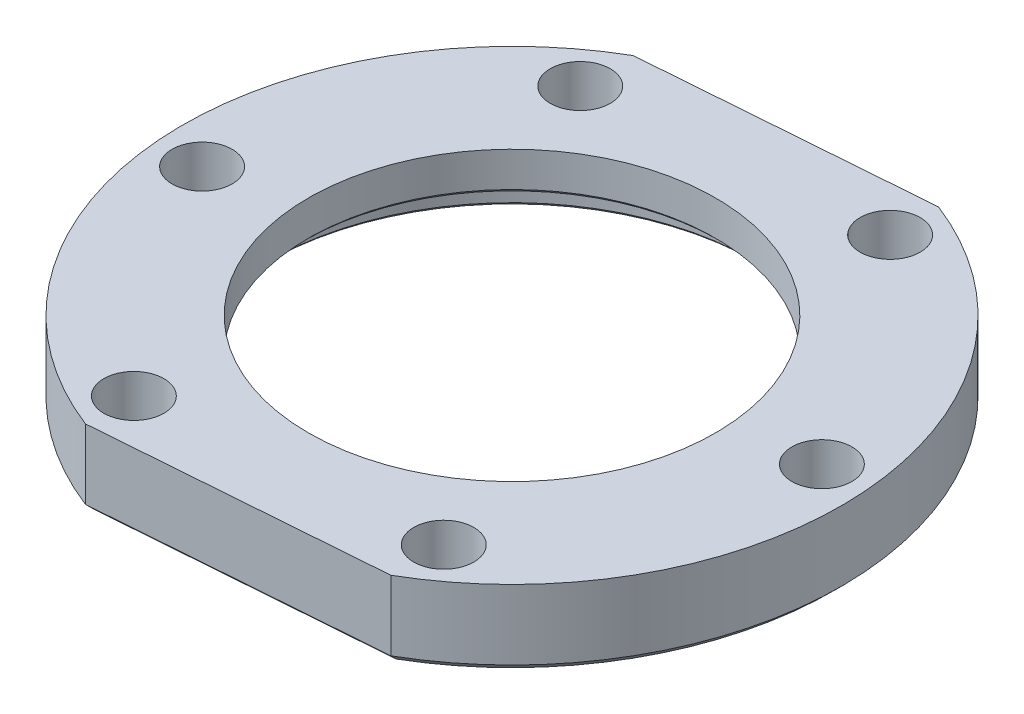
ISO-10303-21;
HEADER;
FILE_DESCRIPTION(('STEP AP214'),'2;1');
FILE_NAME('part.step','',(''),(''),'','','');
FILE_SCHEMA(('AUTOMOTIVE_DESIGN { 1 0 10303 214 1 1 1 1 }'));
ENDSEC;
DATA;
#1=APPLICATION_CONTEXT('core data for automotive mechanical design processes');
#2=APPLICATION_PROTOCOL_DEFINITION('international standard','automotive_design',2000,#1);
#3=PRODUCT_CONTEXT('',#1,'mechanical');
#4=PRODUCT('Part','Part','',(#3));
#5=PRODUCT_RELATED_PRODUCT_CATEGORY('part','',(#4));
#6=PRODUCT_DEFINITION_FORMATION('','',#4);
#7=PRODUCT_DEFINITION_CONTEXT('part definition',#1,'design');
#8=PRODUCT_DEFINITION('design','',#6,#7);
#9=PRODUCT_DEFINITION_SHAPE('','',#8);
#10=(LENGTH_UNIT() NAMED_UNIT(*) SI_UNIT(.MILLI.,.METRE.));
#11=(NAMED_UNIT(*) PLANE_ANGLE_UNIT() SI_UNIT($,.RADIAN.));
#12=(NAMED_UNIT(*) SI_UNIT($,.STERADIAN.) SOLID_ANGLE_UNIT());
#13=UNCERTAINTY_MEASURE_WITH_UNIT(LENGTH_MEASURE(1.E-05),#10,'distance_accuracy_value','');
#14=(GEOMETRIC_REPRESENTATION_CONTEXT(3) GLOBAL_UNCERTAINTY_ASSIGNED_CONTEXT((#13)) GLOBAL_UNIT_ASSIGNED_CONTEXT((#10,
#11,#12)) REPRESENTATION_CONTEXT('',''));
#15=CARTESIAN_POINT('',(0.,0.,0.));
#16=DIRECTION('',(0.,0.,1.));
#17=DIRECTION('',(1.,0.,0.));
#18=AXIS2_PLACEMENT_3D('',#15,#16,#17);
#19=CARTESIAN_POINT('',(0.,4.,0.));
#20=DIRECTION('',(0.,-1.,0.));
#21=DIRECTION('',(0.,0.,-1.));
#22=AXIS2_PLACEMENT_3D('',#19,#20,#21);
#23=CYLINDRICAL_SURFACE('',#22,12.5);
#24=CARTESIAN_POINT('',(0.,0.199999999999994,0.));
#25=DIRECTION('',(0.,1.,0.));
#26=DIRECTION('',(0.,0.,1.));
#27=AXIS2_PLACEMENT_3D('',#24,#25,#26);
#28=CIRCLE('',#27,12.5);
#29=CARTESIAN_POINT('',(0.,0.199999999999994,-12.5));
#30=VERTEX_POINT('',#29);
#31=EDGE_CURVE('E140',#30,#30,#28,.F.);
#32=ORIENTED_EDGE('',*,*,#31,.T.);
#33=EDGE_LOOP('',(#32));
#34=FACE_BOUND('',#33,.T.);
#35=CARTESIAN_POINT('',(0.,1.8,0.));
#36=DIRECTION('',(0.,1.,0.));
#37=DIRECTION('',(0.,0.,1.));
#38=AXIS2_PLACEMENT_3D('',#35,#36,#37);
#39=CIRCLE('',#38,12.5);
#40=CARTESIAN_POINT('',(0.,1.8,12.5));
#41=VERTEX_POINT('',#40);
#42=EDGE_CURVE('E137',#41,#41,#39,.T.);
#43=ORIENTED_EDGE('',*,*,#42,.T.);
#44=EDGE_LOOP('',(#43));
#45=FACE_BOUND('',#44,.T.);
#46=ADVANCED_FACE('F35',(#34,#45),#23,.F.);
#47=CARTESIAN_POINT('',(0.,4.,0.));
#48=DIRECTION('',(0.,-1.,0.));
#49=DIRECTION('',(0.,0.,-1.));
#50=AXIS2_PLACEMENT_3D('',#47,#48,#49);
#51=CYLINDRICAL_SURFACE('',#50,17.);
#52=DIRECTION('',(0.,1.,0.));
#53=VECTOR('',#52,1.);
#54=CARTESIAN_POINT('',(-8.485,0.,-14.7310819358254));
#55=LINE('',#54,#53);
#56=CARTESIAN_POINT('',(-8.485,0.400000000000005,-14.7310819358254));
#57=VERTEX_POINT('',#56);
#58=CARTESIAN_POINT('',(-8.485,4.,-14.7310819358254));
#59=VERTEX_POINT('',#58);
#60=EDGE_CURVE('E301',#57,#59,#55,.T.);
#61=ORIENTED_EDGE('',*,*,#60,.F.);
#62=CARTESIAN_POINT('',(0.,0.400000000000005,0.));
#63=DIRECTION('',(0.,1.,0.));
#64=DIRECTION('',(0.,0.,1.));
#65=AXIS2_PLACEMENT_3D('',#62,#63,#64);
#66=CIRCLE('',#65,17.);
#67=CARTESIAN_POINT('',(-6.15443615108892,0.400000000000005,15.846858226859));
#68=VERTEX_POINT('',#67);
#69=EDGE_CURVE('E153',#57,#68,#66,.T.);
#70=ORIENTED_EDGE('',*,*,#69,.T.);
#71=DIRECTION('',(0.,1.,0.));
#72=VECTOR('',#71,1.);
#73=CARTESIAN_POINT('',(-6.15443615108892,0.,15.846858226859));
#74=LINE('',#73,#72);
#75=CARTESIAN_POINT('',(-6.15443615108892,4.,15.846858226859));
#76=VERTEX_POINT('',#75);
#77=EDGE_CURVE('E104',#68,#76,#74,.T.);
#78=ORIENTED_EDGE('',*,*,#77,.T.);
#79=CARTESIAN_POINT('',(0.,4.,0.));
#80=DIRECTION('',(0.,1.,0.));
#81=DIRECTION('',(0.,0.,1.));
#82=AXIS2_PLACEMENT_3D('',#79,#80,#81);
#83=CIRCLE('',#82,17.);
#84=EDGE_CURVE('E113',#59,#76,#83,.T.);
#85=ORIENTED_EDGE('',*,*,#84,.F.);
#86=EDGE_LOOP('',(#61,#70,#78,#85));
#87=FACE_BOUND('',#86,.T.);
#88=ADVANCED_FACE('F198',(#87),#51,.T.);
#89=CARTESIAN_POINT('',(0.,4.,0.));
#90=DIRECTION('',(0.,1.,0.));
#91=DIRECTION('',(0.,0.,1.));
#92=AXIS2_PLACEMENT_3D('',#89,#90,#91);
#93=PLANE('',#92);
#94=CARTESIAN_POINT('',(6.15443615108892,4.,-13.3508994366904));
#95=DIRECTION('',(0.,1.,0.));
#96=DIRECTION('',(0.,0.,1.));
#97=AXIS2_PLACEMENT_3D('',#94,#95,#96);
#98=CIRCLE('',#97,1.55);
#99=CARTESIAN_POINT('',(6.15443615108892,4.,-11.8008994366904));
#100=VERTEX_POINT('',#99);
#101=EDGE_CURVE('E310',#100,#100,#98,.T.);
#102=ORIENTED_EDGE('',*,*,#101,.F.);
#103=EDGE_LOOP('',(#102));
#104=FACE_BOUND('',#103,.T.);
#105=DIRECTION('',(0.997108065509057,0.,-0.0759967479355897));
#106=VECTOR('',#105,1.);
#107=CARTESIAN_POINT('',(-8.485,4.,-14.7310819358254));
#108=LINE('',#107,#106);
#109=CARTESIAN_POINT('',(6.15443615108892,4.,-15.846858226859));
#110=VERTEX_POINT('',#109);
#111=EDGE_CURVE('E303',#59,#110,#108,.T.);
#112=ORIENTED_EDGE('',*,*,#111,.F.);
#113=ORIENTED_EDGE('',*,*,#84,.T.);
#114=DIRECTION('',(-0.997108065509057,0.,0.0759967479355892));
#115=VECTOR('',#114,1.);
#116=CARTESIAN_POINT('',(-6.15443615108892,4.,15.846858226859));
#117=LINE('',#116,#115);
#118=CARTESIAN_POINT('',(8.48499999999999,4.,14.7310819358254));
#119=VERTEX_POINT('',#118);
#120=EDGE_CURVE('E98',#119,#76,#117,.T.);
#121=ORIENTED_EDGE('',*,*,#120,.F.);
#122=EDGE_CURVE('E111',#119,#110,#83,.T.);
#123=ORIENTED_EDGE('',*,*,#122,.T.);
#124=EDGE_LOOP('',(#112,#113,#121,#123));
#125=FACE_BOUND('',#124,.T.);
#126=CARTESIAN_POINT('',(14.6394361510896,4.,-1.34555166553371));
#127=DIRECTION('',(0.,1.,0.));
#128=DIRECTION('',(0.,0.,1.));
#129=AXIS2_PLACEMENT_3D('',#126,#127,#128);
#130=CIRCLE('',#129,1.55);
#131=CARTESIAN_POINT('',(14.6394361510896,4.,0.204448334466295));
#132=VERTEX_POINT('',#131);
#133=EDGE_CURVE('E289',#132,#132,#130,.T.);
#134=ORIENTED_EDGE('',*,*,#133,.F.);
#135=EDGE_LOOP('',(#134));
#136=FACE_BOUND('',#135,.T.);
#137=CARTESIAN_POINT('',(8.48500000000136,4.,12.0053477711562));
#138=DIRECTION('',(0.,1.,0.));
#139=DIRECTION('',(0.,0.,1.));
#140=AXIS2_PLACEMENT_3D('',#137,#138,#139);
#141=CIRCLE('',#140,1.55);
#142=CARTESIAN_POINT('',(8.48500000000136,4.,13.5553477711562));
#143=VERTEX_POINT('',#142);
#144=EDGE_CURVE('E285',#143,#143,#141,.T.);
#145=ORIENTED_EDGE('',*,*,#144,.F.);
#146=EDGE_LOOP('',(#145));
#147=FACE_BOUND('',#146,.T.);
#148=CARTESIAN_POINT('',(-14.6394361510882,4.,1.34555166553271));
#149=DIRECTION('',(0.,1.,0.));
#150=DIRECTION('',(0.,0.,1.));
#151=AXIS2_PLACEMENT_3D('',#148,#149,#150);
#152=CIRCLE('',#151,1.55);
#153=CARTESIAN_POINT('',(-14.6394361510882,4.,2.89555166553271));
#154=VERTEX_POINT('',#153);
#155=EDGE_CURVE('E103',#154,#154,#152,.T.);
#156=ORIENTED_EDGE('',*,*,#155,.F.);
#157=EDGE_LOOP('',(#156));
#158=FACE_BOUND('',#157,.T.);
#159=CARTESIAN_POINT('',(-6.15443615108756,4.,13.3508994366894));
#160=DIRECTION('',(0.,1.,0.));
#161=DIRECTION('',(0.,0.,1.));
#162=AXIS2_PLACEMENT_3D('',#159,#160,#161);
#163=CIRCLE('',#162,1.55);
#164=CARTESIAN_POINT('',(-6.15443615108756,4.,14.9008994366894));
#165=VERTEX_POINT('',#164);
#166=EDGE_CURVE('E292',#165,#165,#163,.T.);
#167=ORIENTED_EDGE('',*,*,#166,.F.);
#168=EDGE_LOOP('',(#167));
#169=FACE_BOUND('',#168,.T.);
#170=CARTESIAN_POINT('',(-8.485,4.,-12.0053477711572));
#171=DIRECTION('',(0.,1.,0.));
#172=DIRECTION('',(0.,0.,1.));
#173=AXIS2_PLACEMENT_3D('',#170,#171,#172);
#174=CIRCLE('',#173,1.55);
#175=CARTESIAN_POINT('',(-8.485,4.,-10.4553477711572));
#176=VERTEX_POINT('',#175);
#177=EDGE_CURVE('E126',#176,#176,#174,.T.);
#178=ORIENTED_EDGE('',*,*,#177,.F.);
#179=EDGE_LOOP('',(#178));
#180=FACE_BOUND('',#179,.T.);
#181=CARTESIAN_POINT('',(0.,4.,0.));
#182=DIRECTION('',(0.,1.,0.));
#183=DIRECTION('',(0.,0.,1.));
#184=AXIS2_PLACEMENT_3D('',#181,#182,#183);
#185=CIRCLE('',#184,10.5);
#186=CARTESIAN_POINT('',(0.,4.,10.5));
#187=VERTEX_POINT('',#186);
#188=EDGE_CURVE('E114',#187,#187,#185,.T.);
#189=ORIENTED_EDGE('',*,*,#188,.F.);
#190=EDGE_LOOP('',(#189));
#191=FACE_BOUND('',#190,.T.);
#192=ADVANCED_FACE('F109',(#104,#125,#136,#147,#158,#169,#180,#191),#93,.T.);
#193=CARTESIAN_POINT('',(0.,0.,0.));
#194=DIRECTION('',(0.,1.,0.));
#195=DIRECTION('',(0.,0.,1.));
#196=AXIS2_PLACEMENT_3D('',#193,#194,#195);
#197=PLANE('',#196);
#198=CARTESIAN_POINT('',(0.,0.,0.));
#199=DIRECTION('',(0.,1.,0.));
#200=DIRECTION('',(0.,0.,1.));
#201=AXIS2_PLACEMENT_3D('',#198,#199,#200);
#202=CIRCLE('',#201,16.6);
#203=CARTESIAN_POINT('',(6.09371441797392,0.,-15.441070059817));
#204=VERTEX_POINT('',#203);
#205=CARTESIAN_POINT('',(8.36348086853652,0.,14.3391836504602));
#206=VERTEX_POINT('',#205);
#207=EDGE_CURVE('E145',#204,#206,#202,.F.);
#208=ORIENTED_EDGE('',*,*,#207,.T.);
#209=DIRECTION('',(-0.997108065509057,0.,0.0759967479355892));
#210=VECTOR('',#209,1.);
#211=CARTESIAN_POINT('',(1.1348832252813,0.,14.8901268551386));
#212=LINE('',#211,#210);
#213=CARTESIAN_POINT('',(-6.09371441797393,0.,15.441070059817));
#214=VERTEX_POINT('',#213);
#215=EDGE_CURVE('E149',#206,#214,#212,.T.);
#216=ORIENTED_EDGE('',*,*,#215,.T.);
#217=CARTESIAN_POINT('',(0.,0.,0.));
#218=DIRECTION('',(0.,1.,0.));
#219=DIRECTION('',(0.,0.,1.));
#220=AXIS2_PLACEMENT_3D('',#217,#218,#219);
#221=CIRCLE('',#220,16.6);
#222=CARTESIAN_POINT('',(-8.36348086853654,0.,-14.3391836504601));
#223=VERTEX_POINT('',#222);
#224=EDGE_CURVE('E147',#214,#223,#221,.F.);
#225=ORIENTED_EDGE('',*,*,#224,.T.);
#226=DIRECTION('',(0.997108065509057,0.,-0.0759967479355897));
#227=VECTOR('',#226,1.);
#228=CARTESIAN_POINT('',(-1.1348832252813,0.,-14.8901268551386));
#229=LINE('',#228,#227);
#230=EDGE_CURVE('E143',#223,#204,#229,.T.);
#231=ORIENTED_EDGE('',*,*,#230,.T.);
#232=EDGE_LOOP('',(#208,#216,#225,#231));
#233=FACE_BOUND('',#232,.T.);
#234=CARTESIAN_POINT('',(0.,0.,0.));
#235=DIRECTION('',(0.,1.,0.));
#236=DIRECTION('',(0.,0.,1.));
#237=AXIS2_PLACEMENT_3D('',#234,#235,#236);
#238=CIRCLE('',#237,12.7);
#239=CARTESIAN_POINT('',(0.,0.,-12.7));
#240=VERTEX_POINT('',#239);
#241=EDGE_CURVE('E134',#240,#240,#238,.T.);
#242=ORIENTED_EDGE('',*,*,#241,.T.);
#243=EDGE_LOOP('',(#242));
#244=FACE_BOUND('',#243,.T.);
#245=CARTESIAN_POINT('',(6.15443615108892,0.,-13.3508994366904));
#246=DIRECTION('',(0.,1.,0.));
#247=DIRECTION('',(0.,0.,1.));
#248=AXIS2_PLACEMENT_3D('',#245,#246,#247);
#249=CIRCLE('',#248,1.55);
#250=CARTESIAN_POINT('',(6.15443615108892,0.,-11.8008994366904));
#251=VERTEX_POINT('',#250);
#252=EDGE_CURVE('E334',#251,#251,#249,.T.);
#253=ORIENTED_EDGE('',*,*,#252,.T.);
#254=EDGE_LOOP('',(#253));
#255=FACE_BOUND('',#254,.T.);
#256=CARTESIAN_POINT('',(14.6394361510896,0.,-1.34555166553371));
#257=DIRECTION('',(0.,1.,0.));
#258=DIRECTION('',(0.,0.,1.));
#259=AXIS2_PLACEMENT_3D('',#256,#257,#258);
#260=CIRCLE('',#259,1.55);
#261=CARTESIAN_POINT('',(14.6394361510896,0.,0.204448334466295));
#262=VERTEX_POINT('',#261);
#263=EDGE_CURVE('E308',#262,#262,#260,.T.);
#264=ORIENTED_EDGE('',*,*,#263,.T.);
#265=EDGE_LOOP('',(#264));
#266=FACE_BOUND('',#265,.T.);
#267=CARTESIAN_POINT('',(8.48500000000136,0.,12.0053477711562));
#268=DIRECTION('',(0.,1.,0.));
#269=DIRECTION('',(0.,0.,1.));
#270=AXIS2_PLACEMENT_3D('',#267,#268,#269);
#271=CIRCLE('',#270,1.55);
#272=CARTESIAN_POINT('',(8.48500000000136,0.,13.5553477711562));
#273=VERTEX_POINT('',#272);
#274=EDGE_CURVE('E282',#273,#273,#271,.T.);
#275=ORIENTED_EDGE('',*,*,#274,.T.);
#276=EDGE_LOOP('',(#275));
#277=FACE_BOUND('',#276,.T.);
#278=CARTESIAN_POINT('',(-14.6394361510882,0.,1.34555166553271));
#279=DIRECTION('',(0.,1.,0.));
#280=DIRECTION('',(0.,0.,1.));
#281=AXIS2_PLACEMENT_3D('',#278,#279,#280);
#282=CIRCLE('',#281,1.55);
#283=CARTESIAN_POINT('',(-14.6394361510882,0.,2.89555166553271));
#284=VERTEX_POINT('',#283);
#285=EDGE_CURVE('E330',#284,#284,#282,.T.);
#286=ORIENTED_EDGE('',*,*,#285,.T.);
#287=EDGE_LOOP('',(#286));
#288=FACE_BOUND('',#287,.T.);
#289=CARTESIAN_POINT('',(-6.15443615108756,0.,13.3508994366894));
#290=DIRECTION('',(0.,1.,0.));
#291=DIRECTION('',(0.,0.,1.));
#292=AXIS2_PLACEMENT_3D('',#289,#290,#291);
#293=CIRCLE('',#292,1.55);
#294=CARTESIAN_POINT('',(-6.15443615108756,0.,14.9008994366894));
#295=VERTEX_POINT('',#294);
#296=EDGE_CURVE('E287',#295,#295,#293,.T.);
#297=ORIENTED_EDGE('',*,*,#296,.T.);
#298=EDGE_LOOP('',(#297));
#299=FACE_BOUND('',#298,.T.);
#300=CARTESIAN_POINT('',(-8.485,0.,-12.0053477711572));
#301=DIRECTION('',(0.,1.,0.));
#302=DIRECTION('',(0.,0.,1.));
#303=AXIS2_PLACEMENT_3D('',#300,#301,#302);
#304=CIRCLE('',#303,1.55);
#305=CARTESIAN_POINT('',(-8.485,0.,-10.4553477711572));
#306=VERTEX_POINT('',#305);
#307=EDGE_CURVE('E124',#306,#306,#304,.T.);
#308=ORIENTED_EDGE('',*,*,#307,.T.);
#309=EDGE_LOOP('',(#308));
#310=FACE_BOUND('',#309,.T.);
#311=ADVANCED_FACE('F213',(#233,#244,#255,#266,#277,#288,#299,#310),#197,.F.);
#312=DIRECTION('',(0.,1.,0.));
#313=VECTOR('',#312,1.);
#314=CARTESIAN_POINT('',(8.48499999999999,0.,14.7310819358254));
#315=LINE('',#314,#313);
#316=CARTESIAN_POINT('',(8.48499999999999,0.400000000000005,14.7310819358254));
#317=VERTEX_POINT('',#316);
#318=EDGE_CURVE('E94',#317,#119,#315,.T.);
#319=ORIENTED_EDGE('',*,*,#318,.F.);
#320=CARTESIAN_POINT('',(0.,0.400000000000005,0.));
#321=DIRECTION('',(0.,1.,0.));
#322=DIRECTION('',(0.,0.,1.));
#323=AXIS2_PLACEMENT_3D('',#320,#321,#322);
#324=CIRCLE('',#323,17.);
#325=CARTESIAN_POINT('',(6.15443615108892,0.400000000000005,-15.846858226859));
#326=VERTEX_POINT('',#325);
#327=EDGE_CURVE('E50',#317,#326,#324,.T.);
#328=ORIENTED_EDGE('',*,*,#327,.T.);
#329=DIRECTION('',(0.,1.,0.));
#330=VECTOR('',#329,1.);
#331=CARTESIAN_POINT('',(6.15443615108892,0.,-15.846858226859));
#332=LINE('',#331,#330);
#333=EDGE_CURVE('E117',#326,#110,#332,.T.);
#334=ORIENTED_EDGE('',*,*,#333,.T.);
#335=ORIENTED_EDGE('',*,*,#122,.F.);
#336=EDGE_LOOP('',(#319,#328,#334,#335));
#337=FACE_BOUND('',#336,.T.);
#338=ADVANCED_FACE('F116',(#337),#51,.T.);
#339=CARTESIAN_POINT('',(-6.15443615108892,0.,15.846858226859));
#340=DIRECTION('',(-0.0759967479355892,0.,-0.997108065509057));
#341=DIRECTION('',(-0.997108065509057,0.,0.0759967479355892));
#342=AXIS2_PLACEMENT_3D('',#339,#340,#341);
#343=PLANE('',#342);
#344=ORIENTED_EDGE('',*,*,#77,.F.);
#345=DIRECTION('',(0.997108065509057,0.,-0.0759967479355892));
#346=VECTOR('',#345,1.);
#347=CARTESIAN_POINT('',(-6.15443615108892,0.400000000000004,15.846858226859));
#348=LINE('',#347,#346);
#349=EDGE_CURVE('E101',#68,#317,#348,.T.);
#350=ORIENTED_EDGE('',*,*,#349,.T.);
#351=ORIENTED_EDGE('',*,*,#318,.T.);
#352=ORIENTED_EDGE('',*,*,#120,.T.);
#353=EDGE_LOOP('',(#344,#350,#351,#352));
#354=FACE_BOUND('',#353,.T.);
#355=ADVANCED_FACE('F97',(#354),#343,.F.);
#356=CARTESIAN_POINT('',(-8.485,0.,-14.7310819358254));
#357=DIRECTION('',(0.0759967479355897,0.,0.997108065509057));
#358=DIRECTION('',(0.997108065509057,0.,-0.0759967479355897));
#359=AXIS2_PLACEMENT_3D('',#356,#357,#358);
#360=PLANE('',#359);
#361=ORIENTED_EDGE('',*,*,#333,.F.);
#362=DIRECTION('',(-0.997108065509057,0.,0.0759967479355897));
#363=VECTOR('',#362,1.);
#364=CARTESIAN_POINT('',(-8.485,0.400000000000005,-14.7310819358254));
#365=LINE('',#364,#363);
#366=EDGE_CURVE('E11',#326,#57,#365,.T.);
#367=ORIENTED_EDGE('',*,*,#366,.T.);
#368=ORIENTED_EDGE('',*,*,#60,.T.);
#369=ORIENTED_EDGE('',*,*,#111,.T.);
#370=EDGE_LOOP('',(#361,#367,#368,#369));
#371=FACE_BOUND('',#370,.T.);
#372=ADVANCED_FACE('F261',(#371),#360,.F.);
#373=CARTESIAN_POINT('',(-8.485,0.,-12.0053477711572));
#374=DIRECTION('',(0.,1.,0.));
#375=DIRECTION('',(0.,0.,1.));
#376=AXIS2_PLACEMENT_3D('',#373,#374,#375);
#377=CYLINDRICAL_SURFACE('',#376,1.55);
#378=ORIENTED_EDGE('',*,*,#307,.F.);
#379=EDGE_LOOP('',(#378));
#380=FACE_BOUND('',#379,.T.);
#381=ORIENTED_EDGE('',*,*,#177,.T.);
#382=EDGE_LOOP('',(#381));
#383=FACE_BOUND('',#382,.T.);
#384=ADVANCED_FACE('F209',(#380,#383),#377,.F.);
#385=CARTESIAN_POINT('',(-6.15443615108756,0.,13.3508994366894));
#386=DIRECTION('',(0.,1.,0.));
#387=DIRECTION('',(0.,0.,1.));
#388=AXIS2_PLACEMENT_3D('',#385,#386,#387);
#389=CYLINDRICAL_SURFACE('',#388,1.55);
#390=ORIENTED_EDGE('',*,*,#296,.F.);
#391=EDGE_LOOP('',(#390));
#392=FACE_BOUND('',#391,.T.);
#393=ORIENTED_EDGE('',*,*,#166,.T.);
#394=EDGE_LOOP('',(#393));
#395=FACE_BOUND('',#394,.T.);
#396=ADVANCED_FACE('F262',(#392,#395),#389,.F.);
#397=CARTESIAN_POINT('',(-14.6394361510882,0.,1.34555166553271));
#398=DIRECTION('',(0.,1.,0.));
#399=DIRECTION('',(0.,0.,1.));
#400=AXIS2_PLACEMENT_3D('',#397,#398,#399);
#401=CYLINDRICAL_SURFACE('',#400,1.55);
#402=ORIENTED_EDGE('',*,*,#285,.F.);
#403=EDGE_LOOP('',(#402));
#404=FACE_BOUND('',#403,.T.);
#405=ORIENTED_EDGE('',*,*,#155,.T.);
#406=EDGE_LOOP('',(#405));
#407=FACE_BOUND('',#406,.T.);
#408=ADVANCED_FACE('F265',(#404,#407),#401,.F.);
#409=CARTESIAN_POINT('',(8.48500000000136,0.,12.0053477711562));
#410=DIRECTION('',(0.,1.,0.));
#411=DIRECTION('',(0.,0.,1.));
#412=AXIS2_PLACEMENT_3D('',#409,#410,#411);
#413=CYLINDRICAL_SURFACE('',#412,1.55);
#414=ORIENTED_EDGE('',*,*,#274,.F.);
#415=EDGE_LOOP('',(#414));
#416=FACE_BOUND('',#415,.T.);
#417=ORIENTED_EDGE('',*,*,#144,.T.);
#418=EDGE_LOOP('',(#417));
#419=FACE_BOUND('',#418,.T.);
#420=ADVANCED_FACE('F268',(#416,#419),#413,.F.);
#421=CARTESIAN_POINT('',(14.6394361510896,0.,-1.34555166553371));
#422=DIRECTION('',(0.,1.,0.));
#423=DIRECTION('',(0.,0.,1.));
#424=AXIS2_PLACEMENT_3D('',#421,#422,#423);
#425=CYLINDRICAL_SURFACE('',#424,1.55);
#426=ORIENTED_EDGE('',*,*,#263,.F.);
#427=EDGE_LOOP('',(#426));
#428=FACE_BOUND('',#427,.T.);
#429=ORIENTED_EDGE('',*,*,#133,.T.);
#430=EDGE_LOOP('',(#429));
#431=FACE_BOUND('',#430,.T.);
#432=ADVANCED_FACE('F255',(#428,#431),#425,.F.);
#433=CARTESIAN_POINT('',(6.15443615108892,0.,-13.3508994366904));
#434=DIRECTION('',(0.,1.,0.));
#435=DIRECTION('',(0.,0.,1.));
#436=AXIS2_PLACEMENT_3D('',#433,#434,#435);
#437=CYLINDRICAL_SURFACE('',#436,1.55);
#438=ORIENTED_EDGE('',*,*,#252,.F.);
#439=EDGE_LOOP('',(#438));
#440=FACE_BOUND('',#439,.T.);
#441=ORIENTED_EDGE('',*,*,#101,.T.);
#442=EDGE_LOOP('',(#441));
#443=FACE_BOUND('',#442,.T.);
#444=ADVANCED_FACE('F246',(#440,#443),#437,.F.);
#445=CARTESIAN_POINT('',(0.,2.,0.));
#446=DIRECTION('',(0.,1.,0.));
#447=DIRECTION('',(0.,0.,1.));
#448=AXIS2_PLACEMENT_3D('',#445,#446,#447);
#449=PLANE('',#448);
#450=CARTESIAN_POINT('',(0.,2.,0.));
#451=DIRECTION('',(0.,1.,0.));
#452=DIRECTION('',(0.,0.,1.));
#453=AXIS2_PLACEMENT_3D('',#450,#451,#452);
#454=CIRCLE('',#453,10.7);
#455=CARTESIAN_POINT('',(0.,2.,10.7));
#456=VERTEX_POINT('',#455);
#457=EDGE_CURVE('E122',#456,#456,#454,.T.);
#458=ORIENTED_EDGE('',*,*,#457,.T.);
#459=EDGE_LOOP('',(#458));
#460=FACE_BOUND('',#459,.T.);
#461=CARTESIAN_POINT('',(0.,2.,0.));
#462=DIRECTION('',(0.,1.,0.));
#463=DIRECTION('',(0.,0.,1.));
#464=AXIS2_PLACEMENT_3D('',#461,#462,#463);
#465=CIRCLE('',#464,12.3);
#466=CARTESIAN_POINT('',(0.,2.,12.3));
#467=VERTEX_POINT('',#466);
#468=EDGE_CURVE('E119',#467,#467,#465,.F.);
#469=ORIENTED_EDGE('',*,*,#468,.T.);
#470=EDGE_LOOP('',(#469));
#471=FACE_BOUND('',#470,.T.);
#472=ADVANCED_FACE('F244',(#460,#471),#449,.F.);
#473=CARTESIAN_POINT('',(0.,2.,0.));
#474=DIRECTION('',(0.,1.,0.));
#475=DIRECTION('',(0.,0.,1.));
#476=AXIS2_PLACEMENT_3D('',#473,#474,#475);
#477=CYLINDRICAL_SURFACE('',#476,10.5);
#478=CARTESIAN_POINT('',(0.,2.2,0.));
#479=DIRECTION('',(0.,1.,0.));
#480=DIRECTION('',(0.,0.,1.));
#481=AXIS2_PLACEMENT_3D('',#478,#479,#480);
#482=CIRCLE('',#481,10.5);
#483=CARTESIAN_POINT('',(0.,2.2,10.5));
#484=VERTEX_POINT('',#483);
#485=EDGE_CURVE('E131',#484,#484,#482,.F.);
#486=ORIENTED_EDGE('',*,*,#485,.T.);
#487=EDGE_LOOP('',(#486));
#488=FACE_BOUND('',#487,.T.);
#489=ORIENTED_EDGE('',*,*,#188,.T.);
#490=EDGE_LOOP('',(#489));
#491=FACE_BOUND('',#490,.T.);
#492=ADVANCED_FACE('F227',(#488,#491),#477,.F.);
#493=CARTESIAN_POINT('',(0.,2.,0.));
#494=DIRECTION('',(0.,-1.,0.));
#495=DIRECTION('',(0.,0.,-1.));
#496=AXIS2_PLACEMENT_3D('',#493,#494,#495);
#497=CONICAL_SURFACE('',#496,10.7,0.785398163397457);
#498=ORIENTED_EDGE('',*,*,#485,.F.);
#499=EDGE_LOOP('',(#498));
#500=FACE_BOUND('',#499,.T.);
#501=ORIENTED_EDGE('',*,*,#457,.F.);
#502=EDGE_LOOP('',(#501));
#503=FACE_BOUND('',#502,.T.);
#504=ADVANCED_FACE('F220',(#500,#503),#497,.F.);
#505=CARTESIAN_POINT('',(0.,0.,0.));
#506=DIRECTION('',(0.,-1.,0.));
#507=DIRECTION('',(0.,0.,-1.));
#508=AXIS2_PLACEMENT_3D('',#505,#506,#507);
#509=CONICAL_SURFACE('',#508,12.7,0.785398163397461);
#510=CARTESIAN_POINT('',(0.,0.199999999999994,-12.5));
#511=CARTESIAN_POINT('',(0.,0.19791666666666,-12.5020833333333));
#512=CARTESIAN_POINT('',(0.,0.195833333333327,-12.5041666666667));
#513=CARTESIAN_POINT('',(0.,0.191666666666661,-12.5083333333333));
#514=CARTESIAN_POINT('',(0.,0.189583333333327,-12.5104166666667));
#515=CARTESIAN_POINT('',(0.,0.185416666666661,-12.5145833333333));
#516=CARTESIAN_POINT('',(0.,0.183333333333327,-12.5166666666667));
#517=CARTESIAN_POINT('',(0.,0.179166666666661,-12.5208333333333));
#518=CARTESIAN_POINT('',(0.,0.177083333333328,-12.5229166666667));
#519=CARTESIAN_POINT('',(0.,0.172916666666661,-12.5270833333333));
#520=CARTESIAN_POINT('',(0.,0.170833333333328,-12.5291666666667));
#521=CARTESIAN_POINT('',(0.,0.166666666666661,-12.5333333333333));
#522=CARTESIAN_POINT('',(0.,0.164583333333328,-12.5354166666667));
#523=CARTESIAN_POINT('',(0.,0.160416666666661,-12.5395833333333));
#524=CARTESIAN_POINT('',(0.,0.158333333333328,-12.5416666666667));
#525=CARTESIAN_POINT('',(0.,0.154166666666662,-12.5458333333333));
#526=CARTESIAN_POINT('',(0.,0.152083333333329,-12.5479166666667));
#527=CARTESIAN_POINT('',(0.,0.147916666666662,-12.5520833333333));
#528=CARTESIAN_POINT('',(0.,0.145833333333328,-12.5541666666667));
#529=CARTESIAN_POINT('',(0.,0.141666666666662,-12.5583333333333));
#530=CARTESIAN_POINT('',(0.,0.139583333333329,-12.5604166666667));
#531=CARTESIAN_POINT('',(0.,0.135416666666662,-12.5645833333333));
#532=CARTESIAN_POINT('',(0.,0.133333333333329,-12.5666666666667));
#533=CARTESIAN_POINT('',(0.,0.129166666666662,-12.5708333333333));
#534=CARTESIAN_POINT('',(0.,0.127083333333329,-12.5729166666667));
#535=CARTESIAN_POINT('',(0.,0.122916666666663,-12.5770833333333));
#536=CARTESIAN_POINT('',(0.,0.12083333333333,-12.5791666666667));
#537=CARTESIAN_POINT('',(0.,0.116666666666663,-12.5833333333333));
#538=CARTESIAN_POINT('',(0.,0.11458333333333,-12.5854166666667));
#539=CARTESIAN_POINT('',(0.,0.110416666666663,-12.5895833333333));
#540=CARTESIAN_POINT('',(0.,0.10833333333333,-12.5916666666667));
#541=CARTESIAN_POINT('',(0.,0.104166666666664,-12.5958333333333));
#542=CARTESIAN_POINT('',(0.,0.10208333333333,-12.5979166666667));
#543=CARTESIAN_POINT('',(0.,0.0979166666666634,-12.6020833333333));
#544=CARTESIAN_POINT('',(0.,0.09583333333333,-12.6041666666667));
#545=CARTESIAN_POINT('',(0.,0.0916666666666636,-12.6083333333333));
#546=CARTESIAN_POINT('',(0.,0.0895833333333306,-12.6104166666667));
#547=CARTESIAN_POINT('',(0.,0.085416666666664,-12.6145833333333));
#548=CARTESIAN_POINT('',(0.,0.0833333333333305,-12.6166666666667));
#549=CARTESIAN_POINT('',(0.,0.079166666666664,-12.6208333333333));
#550=CARTESIAN_POINT('',(0.,0.0770833333333309,-12.6229166666667));
#551=CARTESIAN_POINT('',(0.,0.0729166666666645,-12.6270833333333));
#552=CARTESIAN_POINT('',(0.,0.0708333333333311,-12.6291666666667));
#553=CARTESIAN_POINT('',(0.,0.0666666666666644,-12.6333333333333));
#554=CARTESIAN_POINT('',(0.,0.0645833333333311,-12.6354166666667));
#555=CARTESIAN_POINT('',(0.,0.0604166666666646,-12.6395833333333));
#556=CARTESIAN_POINT('',(0.,0.0583333333333316,-12.6416666666667));
#557=CARTESIAN_POINT('',(0.,0.0541666666666651,-12.6458333333333));
#558=CARTESIAN_POINT('',(0.,0.0520833333333318,-12.6479166666667));
#559=CARTESIAN_POINT('',(0.,0.047916666666665,-12.6520833333333));
#560=CARTESIAN_POINT('',(0.,0.0458333333333317,-12.6541666666667));
#561=CARTESIAN_POINT('',(0.,0.0416666666666652,-12.6583333333333));
#562=CARTESIAN_POINT('',(0.,0.0395833333333322,-12.6604166666667));
#563=CARTESIAN_POINT('',(0.,0.0354166666666657,-12.6645833333333));
#564=CARTESIAN_POINT('',(0.,0.0333333333333324,-12.6666666666667));
#565=CARTESIAN_POINT('',(0.,0.0291666666666656,-12.6708333333333));
#566=CARTESIAN_POINT('',(0.,0.0270833333333323,-12.6729166666667));
#567=CARTESIAN_POINT('',(0.,0.0229166666666658,-12.6770833333333));
#568=CARTESIAN_POINT('',(0.,0.0208333333333328,-12.6791666666667));
#569=CARTESIAN_POINT('',(0.,0.0166666666666663,-12.6833333333333));
#570=CARTESIAN_POINT('',(0.,0.0145833333333328,-12.6854166666667));
#571=CARTESIAN_POINT('',(0.,0.0104166666666661,-12.6895833333333));
#572=CARTESIAN_POINT('',(0.,0.00833333333333304,-12.6916666666667));
#573=CARTESIAN_POINT('',(0.,0.00416666666666684,-12.6958333333333));
#574=CARTESIAN_POINT('',(0.,0.00208333333333374,-12.6979166666667));
#575=CARTESIAN_POINT('',(0.,0.,-12.7));
#576=B_SPLINE_CURVE_WITH_KNOTS('',3,(#510,#511,#512,#513,#514,#515,#516,#517,#518,#519,#520,
#521,#522,#523,#524,#525,#526,#527,#528,#529,#530,#531,#532,#533,#534,#535,#536,#537,#538,#539,
#540,#541,#542,#543,#544,#545,#546,#547,#548,#549,#550,#551,#552,#553,#554,#555,#556,#557,#558,
#559,#560,#561,#562,#563,#564,#565,#566,#567,#568,#569,#570,#571,#572,#573,#574,#575),
.UNSPECIFIED.,.F.,.F.,(4,2,2,2,2,2,2,2,2,2,2,2,2,2,2,2,2,2,2,2,2,2,2,2,2,2,2,2,2,2,2,2,4),(0.,
0.00883883476483122,0.0176776695296637,0.0265165042944949,0.0353553390593273,0.0441941738241585,
0.0530330085889898,0.0618718433538222,0.0707106781186534,0.0795495128834846,0.0883883476483171,
0.0972271824131483,0.10606601717798,0.114904851942812,0.123743686707643,0.132582521472476,
0.141421356237307,0.150260191002138,0.15909902576697,0.167937860531802,0.176776695296634,
0.185615530061465,0.194454364826297,0.203293199591129,0.21213203435596,0.220970869120791,
0.229809703885624,0.238648538650455,0.247487373415286,0.256326208180119,0.26516504294495,
0.274003877709782,0.282842712474614),.UNSPECIFIED.);
#577=EDGE_CURVE('BSEAM226',#30,#240,#576,.T.);
#578=ORIENTED_EDGE('',*,*,#31,.F.);
#579=ORIENTED_EDGE('',*,*,#241,.F.);
#580=ORIENTED_EDGE('',*,*,#577,.T.);
#581=ORIENTED_EDGE('',*,*,#577,.F.);
#582=EDGE_LOOP('',(#578,#580,#579,#581));
#583=FACE_BOUND('',#582,.T.);
#584=ADVANCED_FACE('F226',(#583),#509,.F.);
#585=CARTESIAN_POINT('',(0.,1.8,0.));
#586=DIRECTION('',(0.,-1.,0.));
#587=DIRECTION('',(0.,0.,-1.));
#588=AXIS2_PLACEMENT_3D('',#585,#586,#587);
#589=CONICAL_SURFACE('',#588,12.5,0.78539816339744);
#590=ORIENTED_EDGE('',*,*,#468,.F.);
#591=EDGE_LOOP('',(#590));
#592=FACE_BOUND('',#591,.T.);
#593=ORIENTED_EDGE('',*,*,#42,.F.);
#594=EDGE_LOOP('',(#593));
#595=FACE_BOUND('',#594,.T.);
#596=ADVANCED_FACE('F194',(#592,#595),#589,.F.);
#597=CARTESIAN_POINT('',(-1.1348832252813,0.,-14.8901268551386));
#598=DIRECTION('',(0.0537378158133806,0.707106781186543,0.705061874697259));
#599=DIRECTION('',(0.997108065509057,0.,-0.0759967479355897));
#600=AXIS2_PLACEMENT_3D('',#597,#598,#599);
#601=PLANE('',#600);
#602=CARTESIAN_POINT('',(-8.36348086853654,0.,-14.3391836504601));
#603=CARTESIAN_POINT('',(-8.38382594985367,0.0666560469718215,-14.404482377055));
#604=CARTESIAN_POINT('',(-8.40412508483004,0.133317403887546,-14.4697899308941));
#605=CARTESIAN_POINT('',(-8.44463146198399,0.266650737220942,-14.6004226926826));
#606=CARTESIAN_POINT('',(-8.46483870416212,0.333322713638553,-14.6657479006319));
#607=CARTESIAN_POINT('',(-8.485,0.400000000000004,-14.7310819358254));
#608=B_SPLINE_CURVE_WITH_KNOTS('',3,(#602,#603,#604,#605,#606,#607),.UNSPECIFIED.,.F.,.F.,(4,2,
4),(0.,0.286509706250428,0.573019410842581),.UNSPECIFIED.);
#609=EDGE_CURVE('E326',#57,#223,#608,.F.);
#610=ORIENTED_EDGE('',*,*,#609,.F.);
#611=ORIENTED_EDGE('',*,*,#366,.F.);
#612=CARTESIAN_POINT('',(6.15443615108892,0.400000000000005,-15.846858226859));
#613=CARTESIAN_POINT('',(6.14440936910032,0.333322713638553,-15.7792233420179));
#614=CARTESIAN_POINT('',(6.13433583369454,0.266650737220942,-15.7115902191084));
#615=CARTESIAN_POINT('',(6.11409525599008,0.133317403887546,-15.576327496761));
#616=CARTESIAN_POINT('',(6.10392821369086,0.0666560469718227,-15.5086978973232));
#617=CARTESIAN_POINT('',(6.09371441797392,0.,-15.441070059817));
#618=B_SPLINE_CURVE_WITH_KNOTS('',3,(#612,#613,#614,#615,#616,#617),.UNSPECIFIED.,.F.,.F.,(4,2,
4),(0.,0.286509704592154,0.57301941084258),.UNSPECIFIED.);
#619=EDGE_CURVE('E41',#204,#326,#618,.F.);
#620=ORIENTED_EDGE('',*,*,#619,.F.);
#621=ORIENTED_EDGE('',*,*,#230,.F.);
#622=EDGE_LOOP('',(#610,#611,#620,#621));
#623=FACE_BOUND('',#622,.T.);
#624=ADVANCED_FACE('F38',(#623),#601,.F.);
#625=CARTESIAN_POINT('',(0.,0.400000000000005,0.));
#626=DIRECTION('',(0.,1.,0.));
#627=DIRECTION('',(0.,0.,1.));
#628=AXIS2_PLACEMENT_3D('',#625,#626,#627);
#629=CONICAL_SURFACE('',#628,17.,0.78539816339744);
#630=ORIENTED_EDGE('',*,*,#619,.T.);
#631=ORIENTED_EDGE('',*,*,#327,.F.);
#632=CARTESIAN_POINT('',(8.48499999999999,0.400000000000004,14.7310819358254));
#633=CARTESIAN_POINT('',(8.46483870416211,0.333322713638553,14.6657479006319));
#634=CARTESIAN_POINT('',(8.44463146198398,0.266650737220942,14.6004226926826));
#635=CARTESIAN_POINT('',(8.40412508483002,0.133317403887545,14.4697899308941));
#636=CARTESIAN_POINT('',(8.38382594985366,0.0666560469718213,14.404482377055));
#637=CARTESIAN_POINT('',(8.36348086853652,0.,14.3391836504602));
#638=B_SPLINE_CURVE_WITH_KNOTS('',3,(#632,#633,#634,#635,#636,#637),.UNSPECIFIED.,.F.,.F.,(4,2,
4),(0.,0.286509704592152,0.573019410842581),.UNSPECIFIED.);
#639=EDGE_CURVE('E164',#206,#317,#638,.F.);
#640=ORIENTED_EDGE('',*,*,#639,.F.);
#641=ORIENTED_EDGE('',*,*,#207,.F.);
#642=EDGE_LOOP('',(#630,#631,#640,#641));
#643=FACE_BOUND('',#642,.T.);
#644=ADVANCED_FACE('F181',(#643),#629,.T.);
#645=CARTESIAN_POINT('',(0.,0.400000000000005,0.));
#646=DIRECTION('',(0.,1.,0.));
#647=DIRECTION('',(0.,0.,1.));
#648=AXIS2_PLACEMENT_3D('',#645,#646,#647);
#649=CONICAL_SURFACE('',#648,17.,0.78539816339744);
#650=ORIENTED_EDGE('',*,*,#609,.T.);
#651=ORIENTED_EDGE('',*,*,#224,.F.);
#652=CARTESIAN_POINT('',(-6.09371441797393,0.,15.441070059817));
#653=CARTESIAN_POINT('',(-6.10392821369087,0.0666560469718212,15.5086978973232));
#654=CARTESIAN_POINT('',(-6.1140952559901,0.133317403887545,15.576327496761));
#655=CARTESIAN_POINT('',(-6.13433583369456,0.266650737220941,15.7115902191084));
#656=CARTESIAN_POINT('',(-6.14440936910033,0.333322713638552,15.7792233420179));
#657=CARTESIAN_POINT('',(-6.15443615108893,0.400000000000004,15.846858226859));
#658=B_SPLINE_CURVE_WITH_KNOTS('',3,(#652,#653,#654,#655,#656,#657),.UNSPECIFIED.,.F.,.F.,(4,2,
4),(0.,0.286509706250426,0.57301941084258),.UNSPECIFIED.);
#659=EDGE_CURVE('E156',#68,#214,#658,.F.);
#660=ORIENTED_EDGE('',*,*,#659,.F.);
#661=ORIENTED_EDGE('',*,*,#69,.F.);
#662=EDGE_LOOP('',(#650,#651,#660,#661));
#663=FACE_BOUND('',#662,.T.);
#664=ADVANCED_FACE('F170',(#663),#649,.T.);
#665=CARTESIAN_POINT('',(1.1348832252813,0.,14.8901268551386));
#666=DIRECTION('',(-0.0537378158133802,0.707106781186542,-0.70506187469726));
#667=DIRECTION('',(-0.997108065509057,0.,0.0759967479355892));
#668=AXIS2_PLACEMENT_3D('',#665,#666,#667);
#669=PLANE('',#668);
#670=ORIENTED_EDGE('',*,*,#639,.T.);
#671=ORIENTED_EDGE('',*,*,#349,.F.);
#672=ORIENTED_EDGE('',*,*,#659,.T.);
#673=ORIENTED_EDGE('',*,*,#215,.F.);
#674=EDGE_LOOP('',(#670,#671,#672,#673));
#675=FACE_BOUND('',#674,.T.);
#676=ADVANCED_FACE('F174',(#675),#669,.F.);
#677=CLOSED_SHELL('',(#46,#88,#192,#311,#338,#355,#372,#384,#396,#408,#420,#432,#444,#472,#492,
#504,#584,#596,#624,#644,#664,#676));
#678=MANIFOLD_SOLID_BREP('B2',#677);
#679=ADVANCED_BREP_SHAPE_REPRESENTATION('',(#18,#678),#14);
#680=SHAPE_DEFINITION_REPRESENTATION(#9,#679);
ENDSEC;
END-ISO-10303-21;
